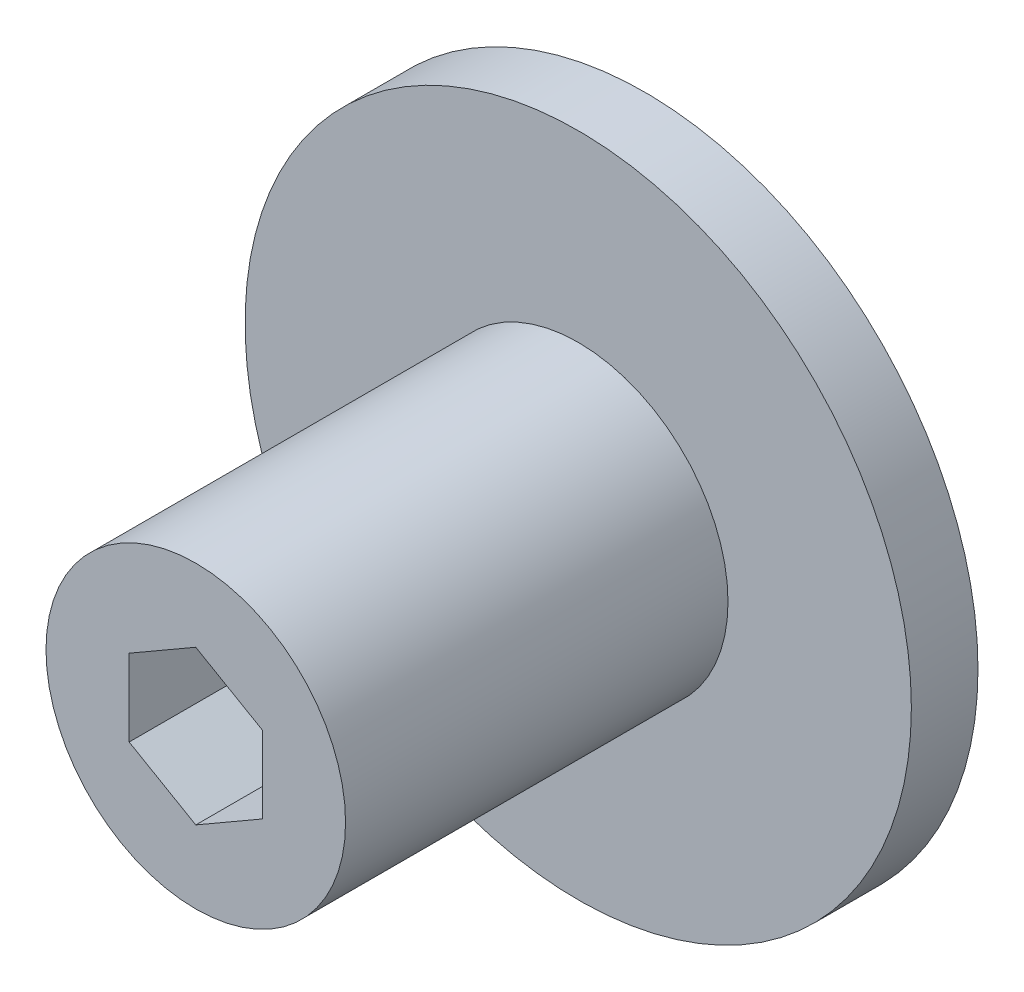
ISO-10303-21;
HEADER;
FILE_DESCRIPTION(('STEP AP214'),'2;1');
FILE_NAME('part.step','',(''),(''),'','','');
FILE_SCHEMA(('AUTOMOTIVE_DESIGN { 1 0 10303 214 1 1 1 1 }'));
ENDSEC;
DATA;
#1=APPLICATION_CONTEXT('core data for automotive mechanical design processes');
#2=APPLICATION_PROTOCOL_DEFINITION('international standard','automotive_design',2000,#1);
#3=PRODUCT_CONTEXT('',#1,'mechanical');
#4=PRODUCT('Part','Part','',(#3));
#5=PRODUCT_RELATED_PRODUCT_CATEGORY('part','',(#4));
#6=PRODUCT_DEFINITION_FORMATION('','',#4);
#7=PRODUCT_DEFINITION_CONTEXT('part definition',#1,'design');
#8=PRODUCT_DEFINITION('design','',#6,#7);
#9=PRODUCT_DEFINITION_SHAPE('','',#8);
#10=(LENGTH_UNIT() NAMED_UNIT(*) SI_UNIT(.MILLI.,.METRE.));
#11=(NAMED_UNIT(*) PLANE_ANGLE_UNIT() SI_UNIT($,.RADIAN.));
#12=(NAMED_UNIT(*) SI_UNIT($,.STERADIAN.) SOLID_ANGLE_UNIT());
#13=UNCERTAINTY_MEASURE_WITH_UNIT(LENGTH_MEASURE(1.E-05),#10,'distance_accuracy_value','');
#14=(GEOMETRIC_REPRESENTATION_CONTEXT(3) GLOBAL_UNCERTAINTY_ASSIGNED_CONTEXT((#13)) GLOBAL_UNIT_ASSIGNED_CONTEXT((#10,
#11,#12)) REPRESENTATION_CONTEXT('',''));
#15=CARTESIAN_POINT('',(0.,0.,0.));
#16=DIRECTION('',(0.,0.,1.));
#17=DIRECTION('',(1.,0.,0.));
#18=AXIS2_PLACEMENT_3D('',#15,#16,#17);
#19=CARTESIAN_POINT('',(0.,0.,3.175));
#20=DIRECTION('',(0.,0.,-1.));
#21=DIRECTION('',(-1.,0.,0.));
#22=AXIS2_PLACEMENT_3D('',#19,#20,#21);
#23=CYLINDRICAL_SURFACE('',#22,31.75);
#24=CARTESIAN_POINT('',(0.,0.,3.175));
#25=DIRECTION('',(0.,0.,1.));
#26=DIRECTION('',(1.,0.,0.));
#27=AXIS2_PLACEMENT_3D('',#24,#25,#26);
#28=CIRCLE('',#27,31.75);
#29=CARTESIAN_POINT('',(31.75,0.,3.175));
#30=VERTEX_POINT('',#29);
#31=EDGE_CURVE('E11',#30,#30,#28,.T.);
#32=ORIENTED_EDGE('',*,*,#31,.F.);
#33=EDGE_LOOP('',(#32));
#34=FACE_BOUND('',#33,.T.);
#35=CARTESIAN_POINT('',(0.,0.,-3.175));
#36=DIRECTION('',(0.,0.,1.));
#37=DIRECTION('',(1.,0.,0.));
#38=AXIS2_PLACEMENT_3D('',#35,#36,#37);
#39=CIRCLE('',#38,31.75);
#40=CARTESIAN_POINT('',(31.75,0.,-3.175));
#41=VERTEX_POINT('',#40);
#42=EDGE_CURVE('E35',#41,#41,#39,.T.);
#43=ORIENTED_EDGE('',*,*,#42,.T.);
#44=EDGE_LOOP('',(#43));
#45=FACE_BOUND('',#44,.T.);
#46=ADVANCED_FACE('F32',(#34,#45),#23,.T.);
#47=CARTESIAN_POINT('',(0.,0.,3.175));
#48=DIRECTION('',(0.,0.,1.));
#49=DIRECTION('',(1.,0.,0.));
#50=AXIS2_PLACEMENT_3D('',#47,#48,#49);
#51=PLANE('',#50);
#52=CARTESIAN_POINT('',(0.,0.,3.175));
#53=DIRECTION('',(0.,0.,1.));
#54=DIRECTION('',(1.,0.,0.));
#55=AXIS2_PLACEMENT_3D('',#52,#53,#54);
#56=CIRCLE('',#55,14.2748);
#57=CARTESIAN_POINT('',(14.2748,0.,3.175));
#58=VERTEX_POINT('',#57);
#59=EDGE_CURVE('E427',#58,#58,#56,.T.);
#60=ORIENTED_EDGE('',*,*,#59,.F.);
#61=EDGE_LOOP('',(#60));
#62=FACE_BOUND('',#61,.T.);
#63=ORIENTED_EDGE('',*,*,#31,.T.);
#64=EDGE_LOOP('',(#63));
#65=FACE_BOUND('',#64,.T.);
#66=ADVANCED_FACE('F481',(#62,#65),#51,.T.);
#67=CARTESIAN_POINT('',(0.,0.,-3.175));
#68=DIRECTION('',(0.,0.,1.));
#69=DIRECTION('',(1.,0.,0.));
#70=AXIS2_PLACEMENT_3D('',#67,#68,#69);
#71=PLANE('',#70);
#72=DIRECTION('',(0.,-1.,0.));
#73=VECTOR('',#72,1.);
#74=CARTESIAN_POINT('',(10.0667013276303,1.984375,-3.175));
#75=LINE('',#74,#73);
#76=CARTESIAN_POINT('',(10.0667013276303,1.984375,-3.175));
#77=VERTEX_POINT('',#76);
#78=CARTESIAN_POINT('',(10.0667013276303,-1.984375,-3.175));
#79=VERTEX_POINT('',#78);
#80=EDGE_CURVE('E357',#77,#79,#75,.T.);
#81=ORIENTED_EDGE('',*,*,#80,.F.);
#82=DIRECTION('',(1.,0.,0.));
#83=VECTOR('',#82,1.);
#84=CARTESIAN_POINT('',(10.0667013276303,1.984375,-3.175));
#85=LINE('',#84,#83);
#86=CARTESIAN_POINT('',(7.68545132763034,1.984375,-3.175));
#87=VERTEX_POINT('',#86);
#88=EDGE_CURVE('E54',#87,#77,#85,.T.);
#89=ORIENTED_EDGE('',*,*,#88,.F.);
#90=CARTESIAN_POINT('',(0.,0.,-3.175));
#91=DIRECTION('',(0.,0.,-1.));
#92=DIRECTION('',(-1.,0.,0.));
#93=AXIS2_PLACEMENT_3D('',#90,#91,#92);
#94=CIRCLE('',#93,7.9375);
#95=CARTESIAN_POINT('',(5.56124482444992,5.66360858927672,-3.175));
#96=VERTEX_POINT('',#95);
#97=EDGE_CURVE('E286',#96,#87,#94,.T.);
#98=ORIENTED_EDGE('',*,*,#97,.F.);
#99=DIRECTION('',(-0.5,-0.866025403784438,0.));
#100=VECTOR('',#99,1.);
#101=CARTESIAN_POINT('',(6.75186982444992,7.72583158203841,-3.175));
#102=LINE('',#101,#100);
#103=CARTESIAN_POINT('',(6.75186982444992,7.72583158203841,-3.175));
#104=VERTEX_POINT('',#103);
#105=EDGE_CURVE('E420',#104,#96,#102,.T.);
#106=ORIENTED_EDGE('',*,*,#105,.F.);
#107=DIRECTION('',(0.866025403784439,-0.5,0.));
#108=VECTOR('',#107,1.);
#109=CARTESIAN_POINT('',(3.31483150318043,9.71020658203841,-3.175));
#110=LINE('',#109,#108);
#111=CARTESIAN_POINT('',(3.31483150318043,9.71020658203841,-3.175));
#112=VERTEX_POINT('',#111);
#113=EDGE_CURVE('E417',#112,#104,#110,.T.);
#114=ORIENTED_EDGE('',*,*,#113,.F.);
#115=DIRECTION('',(0.5,0.866025403784439,0.));
#116=VECTOR('',#115,1.);
#117=CARTESIAN_POINT('',(3.31483150318043,9.71020658203841,-3.175));
#118=LINE('',#117,#116);
#119=CARTESIAN_POINT('',(2.12420650318043,7.64798358927672,-3.175));
#120=VERTEX_POINT('',#119);
#121=EDGE_CURVE('E414',#120,#112,#118,.T.);
#122=ORIENTED_EDGE('',*,*,#121,.F.);
#123=CARTESIAN_POINT('',(0.,0.,-3.175));
#124=DIRECTION('',(0.,0.,-1.));
#125=DIRECTION('',(-1.,0.,0.));
#126=AXIS2_PLACEMENT_3D('',#123,#124,#125);
#127=CIRCLE('',#126,7.9375);
#128=CARTESIAN_POINT('',(-2.12420650318042,7.64798358927672,-3.175));
#129=VERTEX_POINT('',#128);
#130=EDGE_CURVE('E411',#129,#120,#127,.T.);
#131=ORIENTED_EDGE('',*,*,#130,.F.);
#132=DIRECTION('',(0.5,-0.866025403784439,0.));
#133=VECTOR('',#132,1.);
#134=CARTESIAN_POINT('',(-3.31483150318043,9.71020658203842,-3.175));
#135=LINE('',#134,#133);
#136=CARTESIAN_POINT('',(-3.31483150318043,9.71020658203842,-3.175));
#137=VERTEX_POINT('',#136);
#138=EDGE_CURVE('E408',#137,#129,#135,.T.);
#139=ORIENTED_EDGE('',*,*,#138,.F.);
#140=DIRECTION('',(0.866025403784439,0.5,0.));
#141=VECTOR('',#140,1.);
#142=CARTESIAN_POINT('',(-6.75186982444992,7.72583158203842,-3.175));
#143=LINE('',#142,#141);
#144=CARTESIAN_POINT('',(-6.75186982444992,7.72583158203842,-3.175));
#145=VERTEX_POINT('',#144);
#146=EDGE_CURVE('E405',#145,#137,#143,.T.);
#147=ORIENTED_EDGE('',*,*,#146,.F.);
#148=DIRECTION('',(-0.5,0.866025403784439,0.));
#149=VECTOR('',#148,1.);
#150=CARTESIAN_POINT('',(-6.75186982444992,7.72583158203842,-3.175));
#151=LINE('',#150,#149);
#152=CARTESIAN_POINT('',(-5.56124482444991,5.66360858927672,-3.175));
#153=VERTEX_POINT('',#152);
#154=EDGE_CURVE('E402',#153,#145,#151,.T.);
#155=ORIENTED_EDGE('',*,*,#154,.F.);
#156=CARTESIAN_POINT('',(0.,0.,-3.175));
#157=DIRECTION('',(0.,0.,-1.));
#158=DIRECTION('',(-1.,0.,0.));
#159=AXIS2_PLACEMENT_3D('',#156,#157,#158);
#160=CIRCLE('',#159,7.9375);
#161=CARTESIAN_POINT('',(-7.68545132763034,1.984375,-3.175));
#162=VERTEX_POINT('',#161);
#163=EDGE_CURVE('E399',#162,#153,#160,.T.);
#164=ORIENTED_EDGE('',*,*,#163,.F.);
#165=DIRECTION('',(1.,0.,0.));
#166=VECTOR('',#165,1.);
#167=CARTESIAN_POINT('',(-10.0667013276303,1.984375,-3.175));
#168=LINE('',#167,#166);
#169=CARTESIAN_POINT('',(-10.0667013276303,1.984375,-3.175));
#170=VERTEX_POINT('',#169);
#171=EDGE_CURVE('E396',#170,#162,#168,.T.);
#172=ORIENTED_EDGE('',*,*,#171,.F.);
#173=DIRECTION('',(0.,1.,0.));
#174=VECTOR('',#173,1.);
#175=CARTESIAN_POINT('',(-10.0667013276303,-1.984375,-3.175));
#176=LINE('',#175,#174);
#177=CARTESIAN_POINT('',(-10.0667013276303,-1.984375,-3.175));
#178=VERTEX_POINT('',#177);
#179=EDGE_CURVE('E393',#178,#170,#176,.T.);
#180=ORIENTED_EDGE('',*,*,#179,.F.);
#181=DIRECTION('',(-1.,0.,0.));
#182=VECTOR('',#181,1.);
#183=CARTESIAN_POINT('',(-10.0667013276303,-1.984375,-3.175));
#184=LINE('',#183,#182);
#185=CARTESIAN_POINT('',(-7.68545132763034,-1.984375,-3.175));
#186=VERTEX_POINT('',#185);
#187=EDGE_CURVE('E390',#186,#178,#184,.T.);
#188=ORIENTED_EDGE('',*,*,#187,.F.);
#189=CARTESIAN_POINT('',(0.,0.,-3.175));
#190=DIRECTION('',(0.,0.,-1.));
#191=DIRECTION('',(-1.,0.,0.));
#192=AXIS2_PLACEMENT_3D('',#189,#190,#191);
#193=CIRCLE('',#192,7.9375);
#194=CARTESIAN_POINT('',(-5.56124482444992,-5.66360858927671,-3.175));
#195=VERTEX_POINT('',#194);
#196=EDGE_CURVE('E387',#195,#186,#193,.T.);
#197=ORIENTED_EDGE('',*,*,#196,.F.);
#198=DIRECTION('',(0.5,0.866025403784439,0.));
#199=VECTOR('',#198,1.);
#200=CARTESIAN_POINT('',(-6.75186982444992,-7.72583158203841,-3.175));
#201=LINE('',#200,#199);
#202=CARTESIAN_POINT('',(-6.75186982444992,-7.72583158203841,-3.175));
#203=VERTEX_POINT('',#202);
#204=EDGE_CURVE('E384',#203,#195,#201,.T.);
#205=ORIENTED_EDGE('',*,*,#204,.F.);
#206=DIRECTION('',(-0.866025403784439,0.5,0.));
#207=VECTOR('',#206,1.);
#208=CARTESIAN_POINT('',(-3.31483150318043,-9.71020658203841,-3.175));
#209=LINE('',#208,#207);
#210=CARTESIAN_POINT('',(-3.31483150318043,-9.71020658203841,-3.175));
#211=VERTEX_POINT('',#210);
#212=EDGE_CURVE('E381',#211,#203,#209,.T.);
#213=ORIENTED_EDGE('',*,*,#212,.F.);
#214=DIRECTION('',(-0.5,-0.866025403784438,0.));
#215=VECTOR('',#214,1.);
#216=CARTESIAN_POINT('',(-3.31483150318043,-9.71020658203841,-3.175));
#217=LINE('',#216,#215);
#218=CARTESIAN_POINT('',(-2.12420650318043,-7.64798358927672,-3.175));
#219=VERTEX_POINT('',#218);
#220=EDGE_CURVE('E378',#219,#211,#217,.T.);
#221=ORIENTED_EDGE('',*,*,#220,.F.);
#222=CARTESIAN_POINT('',(0.,0.,-3.175));
#223=DIRECTION('',(0.,0.,-1.));
#224=DIRECTION('',(-1.,0.,0.));
#225=AXIS2_PLACEMENT_3D('',#222,#223,#224);
#226=CIRCLE('',#225,7.9375);
#227=CARTESIAN_POINT('',(2.12420650318042,-7.64798358927672,-3.175));
#228=VERTEX_POINT('',#227);
#229=EDGE_CURVE('E375',#228,#219,#226,.T.);
#230=ORIENTED_EDGE('',*,*,#229,.F.);
#231=DIRECTION('',(-0.5,0.866025403784438,0.));
#232=VECTOR('',#231,1.);
#233=CARTESIAN_POINT('',(3.31483150318042,-9.71020658203842,-3.175));
#234=LINE('',#233,#232);
#235=CARTESIAN_POINT('',(3.31483150318042,-9.71020658203842,-3.175));
#236=VERTEX_POINT('',#235);
#237=EDGE_CURVE('E372',#236,#228,#234,.T.);
#238=ORIENTED_EDGE('',*,*,#237,.F.);
#239=DIRECTION('',(-0.866025403784439,-0.5,0.));
#240=VECTOR('',#239,1.);
#241=CARTESIAN_POINT('',(6.75186982444991,-7.72583158203842,-3.175));
#242=LINE('',#241,#240);
#243=CARTESIAN_POINT('',(6.75186982444991,-7.72583158203842,-3.175));
#244=VERTEX_POINT('',#243);
#245=EDGE_CURVE('E369',#244,#236,#242,.T.);
#246=ORIENTED_EDGE('',*,*,#245,.F.);
#247=DIRECTION('',(0.5,-0.866025403784438,0.));
#248=VECTOR('',#247,1.);
#249=CARTESIAN_POINT('',(6.75186982444991,-7.72583158203842,-3.175));
#250=LINE('',#249,#248);
#251=CARTESIAN_POINT('',(5.56124482444991,-5.66360858927672,-3.175));
#252=VERTEX_POINT('',#251);
#253=EDGE_CURVE('E366',#252,#244,#250,.T.);
#254=ORIENTED_EDGE('',*,*,#253,.F.);
#255=CARTESIAN_POINT('',(0.,0.,-3.175));
#256=DIRECTION('',(0.,0.,-1.));
#257=DIRECTION('',(-1.,0.,0.));
#258=AXIS2_PLACEMENT_3D('',#255,#256,#257);
#259=CIRCLE('',#258,7.9375);
#260=CARTESIAN_POINT('',(7.68545132763034,-1.984375,-3.175));
#261=VERTEX_POINT('',#260);
#262=EDGE_CURVE('E363',#261,#252,#259,.T.);
#263=ORIENTED_EDGE('',*,*,#262,.F.);
#264=DIRECTION('',(-1.,0.,0.));
#265=VECTOR('',#264,1.);
#266=CARTESIAN_POINT('',(10.0667013276303,-1.984375,-3.175));
#267=LINE('',#266,#265);
#268=EDGE_CURVE('E360',#79,#261,#267,.T.);
#269=ORIENTED_EDGE('',*,*,#268,.F.);
#270=EDGE_LOOP('',(#81,#89,#98,#106,#114,#122,#131,#139,#147,#155,#164,#172,#180,#188,#197,#205,
#213,#221,#230,#238,#246,#254,#263,#269));
#271=FACE_BOUND('',#270,.T.);
#272=ORIENTED_EDGE('',*,*,#42,.F.);
#273=EDGE_LOOP('',(#272));
#274=FACE_BOUND('',#273,.T.);
#275=ADVANCED_FACE('F484',(#271,#274),#71,.F.);
#276=CARTESIAN_POINT('',(0.,0.,39.624));
#277=DIRECTION('',(0.,0.,-1.));
#278=DIRECTION('',(-1.,0.,0.));
#279=AXIS2_PLACEMENT_3D('',#276,#277,#278);
#280=CYLINDRICAL_SURFACE('',#279,14.2748);
#281=CARTESIAN_POINT('',(0.,0.,39.624));
#282=DIRECTION('',(0.,0.,1.));
#283=DIRECTION('',(1.,0.,0.));
#284=AXIS2_PLACEMENT_3D('',#281,#282,#283);
#285=CIRCLE('',#284,14.2748);
#286=CARTESIAN_POINT('',(14.2748,0.,39.624));
#287=VERTEX_POINT('',#286);
#288=EDGE_CURVE('E473',#287,#287,#285,.T.);
#289=ORIENTED_EDGE('',*,*,#288,.F.);
#290=EDGE_LOOP('',(#289));
#291=FACE_BOUND('',#290,.T.);
#292=ORIENTED_EDGE('',*,*,#59,.T.);
#293=EDGE_LOOP('',(#292));
#294=FACE_BOUND('',#293,.T.);
#295=ADVANCED_FACE('F479',(#291,#294),#280,.T.);
#296=CARTESIAN_POINT('',(0.,0.,39.624));
#297=DIRECTION('',(0.,0.,1.));
#298=DIRECTION('',(1.,0.,0.));
#299=AXIS2_PLACEMENT_3D('',#296,#297,#298);
#300=PLANE('',#299);
#301=DIRECTION('',(-0.866025403784439,0.5,0.));
#302=VECTOR('',#301,1.);
#303=CARTESIAN_POINT('',(6.35,3.66617420935412,39.624));
#304=LINE('',#303,#302);
#305=CARTESIAN_POINT('',(6.35,3.66617420935412,39.624));
#306=VERTEX_POINT('',#305);
#307=CARTESIAN_POINT('',(0.,7.33234841870825,39.624));
#308=VERTEX_POINT('',#307);
#309=EDGE_CURVE('E46',#306,#308,#304,.T.);
#310=ORIENTED_EDGE('',*,*,#309,.F.);
#311=DIRECTION('',(0.,1.,0.));
#312=VECTOR('',#311,1.);
#313=CARTESIAN_POINT('',(6.35,-3.66617420935412,39.624));
#314=LINE('',#313,#312);
#315=CARTESIAN_POINT('',(6.35,-3.66617420935412,39.624));
#316=VERTEX_POINT('',#315);
#317=EDGE_CURVE('E249',#316,#306,#314,.T.);
#318=ORIENTED_EDGE('',*,*,#317,.F.);
#319=DIRECTION('',(0.866025403784439,0.5,0.));
#320=VECTOR('',#319,1.);
#321=CARTESIAN_POINT('',(0.,-7.33234841870825,39.624));
#322=LINE('',#321,#320);
#323=CARTESIAN_POINT('',(0.,-7.33234841870825,39.624));
#324=VERTEX_POINT('',#323);
#325=EDGE_CURVE('E252',#324,#316,#322,.T.);
#326=ORIENTED_EDGE('',*,*,#325,.F.);
#327=DIRECTION('',(0.866025403784439,-0.5,0.));
#328=VECTOR('',#327,1.);
#329=CARTESIAN_POINT('',(-6.35,-3.66617420935412,39.624));
#330=LINE('',#329,#328);
#331=CARTESIAN_POINT('',(-6.35,-3.66617420935412,39.624));
#332=VERTEX_POINT('',#331);
#333=EDGE_CURVE('E268',#332,#324,#330,.T.);
#334=ORIENTED_EDGE('',*,*,#333,.F.);
#335=DIRECTION('',(0.,-1.,0.));
#336=VECTOR('',#335,1.);
#337=CARTESIAN_POINT('',(-6.35,3.66617420935412,39.624));
#338=LINE('',#337,#336);
#339=CARTESIAN_POINT('',(-6.35,3.66617420935412,39.624));
#340=VERTEX_POINT('',#339);
#341=EDGE_CURVE('E265',#340,#332,#338,.T.);
#342=ORIENTED_EDGE('',*,*,#341,.F.);
#343=DIRECTION('',(-0.866025403784439,-0.5,0.));
#344=VECTOR('',#343,1.);
#345=CARTESIAN_POINT('',(0.,7.33234841870825,39.624));
#346=LINE('',#345,#344);
#347=EDGE_CURVE('E263',#308,#340,#346,.T.);
#348=ORIENTED_EDGE('',*,*,#347,.F.);
#349=EDGE_LOOP('',(#310,#318,#326,#334,#342,#348));
#350=FACE_BOUND('',#349,.T.);
#351=ORIENTED_EDGE('',*,*,#288,.T.);
#352=EDGE_LOOP('',(#351));
#353=FACE_BOUND('',#352,.T.);
#354=ADVANCED_FACE('F498',(#350,#353),#300,.T.);
#355=CARTESIAN_POINT('',(10.0667013276303,1.984375,22.225));
#356=DIRECTION('',(0.,1.,0.));
#357=DIRECTION('',(-1.,0.,0.));
#358=AXIS2_PLACEMENT_3D('',#355,#356,#357);
#359=PLANE('',#358);
#360=ORIENTED_EDGE('',*,*,#88,.T.);
#361=DIRECTION('',(0.,0.,-1.));
#362=VECTOR('',#361,1.);
#363=CARTESIAN_POINT('',(10.0667013276303,1.984375,22.225));
#364=LINE('',#363,#362);
#365=CARTESIAN_POINT('',(10.0667013276303,1.984375,22.225));
#366=VERTEX_POINT('',#365);
#367=EDGE_CURVE('E355',#366,#77,#364,.T.);
#368=ORIENTED_EDGE('',*,*,#367,.F.);
#369=DIRECTION('',(1.,0.,0.));
#370=VECTOR('',#369,1.);
#371=CARTESIAN_POINT('',(10.0667013276303,1.984375,22.225));
#372=LINE('',#371,#370);
#373=CARTESIAN_POINT('',(7.68545132763034,1.984375,22.225));
#374=VERTEX_POINT('',#373);
#375=EDGE_CURVE('E282',#374,#366,#372,.T.);
#376=ORIENTED_EDGE('',*,*,#375,.F.);
#377=DIRECTION('',(0.,0.,-1.));
#378=VECTOR('',#377,1.);
#379=CARTESIAN_POINT('',(7.68545132763034,1.984375,22.225));
#380=LINE('',#379,#378);
#381=EDGE_CURVE('E425',#374,#87,#380,.T.);
#382=ORIENTED_EDGE('',*,*,#381,.T.);
#383=EDGE_LOOP('',(#360,#368,#376,#382));
#384=FACE_BOUND('',#383,.T.);
#385=ADVANCED_FACE('F505',(#384),#359,.F.);
#386=CARTESIAN_POINT('',(0.,0.,22.225));
#387=DIRECTION('',(0.,0.,-1.));
#388=DIRECTION('',(-1.,0.,0.));
#389=AXIS2_PLACEMENT_3D('',#386,#387,#388);
#390=CYLINDRICAL_SURFACE('',#389,7.9375);
#391=ORIENTED_EDGE('',*,*,#97,.T.);
#392=ORIENTED_EDGE('',*,*,#381,.F.);
#393=CARTESIAN_POINT('',(0.,0.,22.225));
#394=DIRECTION('',(0.,0.,-1.));
#395=DIRECTION('',(-1.,0.,0.));
#396=AXIS2_PLACEMENT_3D('',#393,#394,#395);
#397=CIRCLE('',#396,7.9375);
#398=CARTESIAN_POINT('',(5.56124482444992,5.66360858927672,22.225));
#399=VERTEX_POINT('',#398);
#400=EDGE_CURVE('E352',#399,#374,#397,.T.);
#401=ORIENTED_EDGE('',*,*,#400,.F.);
#402=DIRECTION('',(0.,0.,-1.));
#403=VECTOR('',#402,1.);
#404=CARTESIAN_POINT('',(5.56124482444992,5.66360858927672,22.225));
#405=LINE('',#404,#403);
#406=EDGE_CURVE('E428',#399,#96,#405,.T.);
#407=ORIENTED_EDGE('',*,*,#406,.T.);
#408=EDGE_LOOP('',(#391,#392,#401,#407));
#409=FACE_BOUND('',#408,.T.);
#410=ADVANCED_FACE('F509',(#409),#390,.F.);
#411=CARTESIAN_POINT('',(6.75186982444992,7.72583158203841,22.225));
#412=DIRECTION('',(0.866025403784439,-0.5,0.));
#413=DIRECTION('',(0.5,0.866025403784439,0.));
#414=AXIS2_PLACEMENT_3D('',#411,#412,#413);
#415=PLANE('',#414);
#416=ORIENTED_EDGE('',*,*,#105,.T.);
#417=ORIENTED_EDGE('',*,*,#406,.F.);
#418=DIRECTION('',(-0.5,-0.866025403784438,0.));
#419=VECTOR('',#418,1.);
#420=CARTESIAN_POINT('',(6.75186982444992,7.72583158203841,22.225));
#421=LINE('',#420,#419);
#422=CARTESIAN_POINT('',(6.75186982444992,7.72583158203841,22.225));
#423=VERTEX_POINT('',#422);
#424=EDGE_CURVE('E349',#423,#399,#421,.T.);
#425=ORIENTED_EDGE('',*,*,#424,.F.);
#426=DIRECTION('',(0.,0.,-1.));
#427=VECTOR('',#426,1.);
#428=CARTESIAN_POINT('',(6.75186982444992,7.72583158203841,22.225));
#429=LINE('',#428,#427);
#430=EDGE_CURVE('E430',#423,#104,#429,.T.);
#431=ORIENTED_EDGE('',*,*,#430,.T.);
#432=EDGE_LOOP('',(#416,#417,#425,#431));
#433=FACE_BOUND('',#432,.T.);
#434=ADVANCED_FACE('F594',(#433),#415,.F.);
#435=CARTESIAN_POINT('',(3.31483150318043,9.71020658203841,22.225));
#436=DIRECTION('',(0.5,0.866025403784439,0.));
#437=DIRECTION('',(-0.866025403784439,0.5,0.));
#438=AXIS2_PLACEMENT_3D('',#435,#436,#437);
#439=PLANE('',#438);
#440=ORIENTED_EDGE('',*,*,#113,.T.);
#441=ORIENTED_EDGE('',*,*,#430,.F.);
#442=DIRECTION('',(0.866025403784439,-0.5,0.));
#443=VECTOR('',#442,1.);
#444=CARTESIAN_POINT('',(3.31483150318043,9.71020658203841,22.225));
#445=LINE('',#444,#443);
#446=CARTESIAN_POINT('',(3.31483150318043,9.71020658203841,22.225));
#447=VERTEX_POINT('',#446);
#448=EDGE_CURVE('E346',#447,#423,#445,.T.);
#449=ORIENTED_EDGE('',*,*,#448,.F.);
#450=DIRECTION('',(0.,0.,-1.));
#451=VECTOR('',#450,1.);
#452=CARTESIAN_POINT('',(3.31483150318043,9.71020658203841,22.225));
#453=LINE('',#452,#451);
#454=EDGE_CURVE('E432',#447,#112,#453,.T.);
#455=ORIENTED_EDGE('',*,*,#454,.T.);
#456=EDGE_LOOP('',(#440,#441,#449,#455));
#457=FACE_BOUND('',#456,.T.);
#458=ADVANCED_FACE('F590',(#457),#439,.F.);
#459=CARTESIAN_POINT('',(3.31483150318043,9.71020658203841,22.225));
#460=DIRECTION('',(-0.866025403784439,0.5,0.));
#461=DIRECTION('',(-0.5,-0.866025403784439,0.));
#462=AXIS2_PLACEMENT_3D('',#459,#460,#461);
#463=PLANE('',#462);
#464=ORIENTED_EDGE('',*,*,#121,.T.);
#465=ORIENTED_EDGE('',*,*,#454,.F.);
#466=DIRECTION('',(0.5,0.866025403784439,0.));
#467=VECTOR('',#466,1.);
#468=CARTESIAN_POINT('',(3.31483150318043,9.71020658203841,22.225));
#469=LINE('',#468,#467);
#470=CARTESIAN_POINT('',(2.12420650318043,7.64798358927672,22.225));
#471=VERTEX_POINT('',#470);
#472=EDGE_CURVE('E343',#471,#447,#469,.T.);
#473=ORIENTED_EDGE('',*,*,#472,.F.);
#474=DIRECTION('',(0.,0.,-1.));
#475=VECTOR('',#474,1.);
#476=CARTESIAN_POINT('',(2.12420650318043,7.64798358927672,22.225));
#477=LINE('',#476,#475);
#478=EDGE_CURVE('E434',#471,#120,#477,.T.);
#479=ORIENTED_EDGE('',*,*,#478,.T.);
#480=EDGE_LOOP('',(#464,#465,#473,#479));
#481=FACE_BOUND('',#480,.T.);
#482=ADVANCED_FACE('F586',(#481),#463,.F.);
#483=CARTESIAN_POINT('',(0.,0.,22.225));
#484=DIRECTION('',(0.,0.,-1.));
#485=DIRECTION('',(-1.,0.,0.));
#486=AXIS2_PLACEMENT_3D('',#483,#484,#485);
#487=CYLINDRICAL_SURFACE('',#486,7.9375);
#488=ORIENTED_EDGE('',*,*,#130,.T.);
#489=ORIENTED_EDGE('',*,*,#478,.F.);
#490=CARTESIAN_POINT('',(0.,0.,22.225));
#491=DIRECTION('',(0.,0.,-1.));
#492=DIRECTION('',(-1.,0.,0.));
#493=AXIS2_PLACEMENT_3D('',#490,#491,#492);
#494=CIRCLE('',#493,7.9375);
#495=CARTESIAN_POINT('',(-2.12420650318042,7.64798358927672,22.225));
#496=VERTEX_POINT('',#495);
#497=EDGE_CURVE('E340',#496,#471,#494,.T.);
#498=ORIENTED_EDGE('',*,*,#497,.F.);
#499=DIRECTION('',(0.,0.,-1.));
#500=VECTOR('',#499,1.);
#501=CARTESIAN_POINT('',(-2.12420650318042,7.64798358927672,22.225));
#502=LINE('',#501,#500);
#503=EDGE_CURVE('E436',#496,#129,#502,.T.);
#504=ORIENTED_EDGE('',*,*,#503,.T.);
#505=EDGE_LOOP('',(#488,#489,#498,#504));
#506=FACE_BOUND('',#505,.T.);
#507=ADVANCED_FACE('F582',(#506),#487,.F.);
#508=CARTESIAN_POINT('',(-3.31483150318043,9.71020658203842,22.225));
#509=DIRECTION('',(0.866025403784439,0.5,0.));
#510=DIRECTION('',(-0.5,0.866025403784439,0.));
#511=AXIS2_PLACEMENT_3D('',#508,#509,#510);
#512=PLANE('',#511);
#513=ORIENTED_EDGE('',*,*,#138,.T.);
#514=ORIENTED_EDGE('',*,*,#503,.F.);
#515=DIRECTION('',(0.5,-0.866025403784439,0.));
#516=VECTOR('',#515,1.);
#517=CARTESIAN_POINT('',(-3.31483150318043,9.71020658203842,22.225));
#518=LINE('',#517,#516);
#519=CARTESIAN_POINT('',(-3.31483150318043,9.71020658203842,22.225));
#520=VERTEX_POINT('',#519);
#521=EDGE_CURVE('E337',#520,#496,#518,.T.);
#522=ORIENTED_EDGE('',*,*,#521,.F.);
#523=DIRECTION('',(0.,0.,-1.));
#524=VECTOR('',#523,1.);
#525=CARTESIAN_POINT('',(-3.31483150318043,9.71020658203842,22.225));
#526=LINE('',#525,#524);
#527=EDGE_CURVE('E438',#520,#137,#526,.T.);
#528=ORIENTED_EDGE('',*,*,#527,.T.);
#529=EDGE_LOOP('',(#513,#514,#522,#528));
#530=FACE_BOUND('',#529,.T.);
#531=ADVANCED_FACE('F578',(#530),#512,.F.);
#532=CARTESIAN_POINT('',(-6.75186982444992,7.72583158203842,22.225));
#533=DIRECTION('',(-0.5,0.866025403784438,0.));
#534=DIRECTION('',(-0.866025403784439,-0.5,0.));
#535=AXIS2_PLACEMENT_3D('',#532,#533,#534);
#536=PLANE('',#535);
#537=ORIENTED_EDGE('',*,*,#146,.T.);
#538=ORIENTED_EDGE('',*,*,#527,.F.);
#539=DIRECTION('',(0.866025403784439,0.5,0.));
#540=VECTOR('',#539,1.);
#541=CARTESIAN_POINT('',(-6.75186982444992,7.72583158203842,22.225));
#542=LINE('',#541,#540);
#543=CARTESIAN_POINT('',(-6.75186982444992,7.72583158203842,22.225));
#544=VERTEX_POINT('',#543);
#545=EDGE_CURVE('E334',#544,#520,#542,.T.);
#546=ORIENTED_EDGE('',*,*,#545,.F.);
#547=DIRECTION('',(0.,0.,-1.));
#548=VECTOR('',#547,1.);
#549=CARTESIAN_POINT('',(-6.75186982444992,7.72583158203842,22.225));
#550=LINE('',#549,#548);
#551=EDGE_CURVE('E440',#544,#145,#550,.T.);
#552=ORIENTED_EDGE('',*,*,#551,.T.);
#553=EDGE_LOOP('',(#537,#538,#546,#552));
#554=FACE_BOUND('',#553,.T.);
#555=ADVANCED_FACE('F574',(#554),#536,.F.);
#556=CARTESIAN_POINT('',(-6.75186982444992,7.72583158203842,22.225));
#557=DIRECTION('',(-0.866025403784439,-0.5,0.));
#558=DIRECTION('',(0.5,-0.866025403784439,0.));
#559=AXIS2_PLACEMENT_3D('',#556,#557,#558);
#560=PLANE('',#559);
#561=ORIENTED_EDGE('',*,*,#154,.T.);
#562=ORIENTED_EDGE('',*,*,#551,.F.);
#563=DIRECTION('',(-0.5,0.866025403784439,0.));
#564=VECTOR('',#563,1.);
#565=CARTESIAN_POINT('',(-6.75186982444992,7.72583158203842,22.225));
#566=LINE('',#565,#564);
#567=CARTESIAN_POINT('',(-5.56124482444991,5.66360858927672,22.225));
#568=VERTEX_POINT('',#567);
#569=EDGE_CURVE('E331',#568,#544,#566,.T.);
#570=ORIENTED_EDGE('',*,*,#569,.F.);
#571=DIRECTION('',(0.,0.,-1.));
#572=VECTOR('',#571,1.);
#573=CARTESIAN_POINT('',(-5.56124482444991,5.66360858927672,22.225));
#574=LINE('',#573,#572);
#575=EDGE_CURVE('E442',#568,#153,#574,.T.);
#576=ORIENTED_EDGE('',*,*,#575,.T.);
#577=EDGE_LOOP('',(#561,#562,#570,#576));
#578=FACE_BOUND('',#577,.T.);
#579=ADVANCED_FACE('F570',(#578),#560,.F.);
#580=CARTESIAN_POINT('',(0.,0.,22.225));
#581=DIRECTION('',(0.,0.,-1.));
#582=DIRECTION('',(-1.,0.,0.));
#583=AXIS2_PLACEMENT_3D('',#580,#581,#582);
#584=CYLINDRICAL_SURFACE('',#583,7.9375);
#585=ORIENTED_EDGE('',*,*,#163,.T.);
#586=ORIENTED_EDGE('',*,*,#575,.F.);
#587=CARTESIAN_POINT('',(0.,0.,22.225));
#588=DIRECTION('',(0.,0.,-1.));
#589=DIRECTION('',(-1.,0.,0.));
#590=AXIS2_PLACEMENT_3D('',#587,#588,#589);
#591=CIRCLE('',#590,7.9375);
#592=CARTESIAN_POINT('',(-7.68545132763034,1.984375,22.225));
#593=VERTEX_POINT('',#592);
#594=EDGE_CURVE('E328',#593,#568,#591,.T.);
#595=ORIENTED_EDGE('',*,*,#594,.F.);
#596=DIRECTION('',(0.,0.,-1.));
#597=VECTOR('',#596,1.);
#598=CARTESIAN_POINT('',(-7.68545132763034,1.984375,22.225));
#599=LINE('',#598,#597);
#600=EDGE_CURVE('E444',#593,#162,#599,.T.);
#601=ORIENTED_EDGE('',*,*,#600,.T.);
#602=EDGE_LOOP('',(#585,#586,#595,#601));
#603=FACE_BOUND('',#602,.T.);
#604=ADVANCED_FACE('F566',(#603),#584,.F.);
#605=CARTESIAN_POINT('',(-10.0667013276303,1.984375,22.225));
#606=DIRECTION('',(0.,1.,0.));
#607=DIRECTION('',(0.,0.,1.));
#608=AXIS2_PLACEMENT_3D('',#605,#606,#607);
#609=PLANE('',#608);
#610=ORIENTED_EDGE('',*,*,#171,.T.);
#611=ORIENTED_EDGE('',*,*,#600,.F.);
#612=DIRECTION('',(1.,0.,0.));
#613=VECTOR('',#612,1.);
#614=CARTESIAN_POINT('',(-10.0667013276303,1.984375,22.225));
#615=LINE('',#614,#613);
#616=CARTESIAN_POINT('',(-10.0667013276303,1.984375,22.225));
#617=VERTEX_POINT('',#616);
#618=EDGE_CURVE('E325',#617,#593,#615,.T.);
#619=ORIENTED_EDGE('',*,*,#618,.F.);
#620=DIRECTION('',(0.,0.,-1.));
#621=VECTOR('',#620,1.);
#622=CARTESIAN_POINT('',(-10.0667013276303,1.984375,22.225));
#623=LINE('',#622,#621);
#624=EDGE_CURVE('E446',#617,#170,#623,.T.);
#625=ORIENTED_EDGE('',*,*,#624,.T.);
#626=EDGE_LOOP('',(#610,#611,#619,#625));
#627=FACE_BOUND('',#626,.T.);
#628=ADVANCED_FACE('F562',(#627),#609,.F.);
#629=CARTESIAN_POINT('',(-10.0667013276303,-1.984375,22.225));
#630=DIRECTION('',(-1.,0.,0.));
#631=DIRECTION('',(0.,0.,1.));
#632=AXIS2_PLACEMENT_3D('',#629,#630,#631);
#633=PLANE('',#632);
#634=ORIENTED_EDGE('',*,*,#179,.T.);
#635=ORIENTED_EDGE('',*,*,#624,.F.);
#636=DIRECTION('',(0.,1.,0.));
#637=VECTOR('',#636,1.);
#638=CARTESIAN_POINT('',(-10.0667013276303,-1.984375,22.225));
#639=LINE('',#638,#637);
#640=CARTESIAN_POINT('',(-10.0667013276303,-1.984375,22.225));
#641=VERTEX_POINT('',#640);
#642=EDGE_CURVE('E322',#641,#617,#639,.T.);
#643=ORIENTED_EDGE('',*,*,#642,.F.);
#644=DIRECTION('',(0.,0.,-1.));
#645=VECTOR('',#644,1.);
#646=CARTESIAN_POINT('',(-10.0667013276303,-1.984375,22.225));
#647=LINE('',#646,#645);
#648=EDGE_CURVE('E448',#641,#178,#647,.T.);
#649=ORIENTED_EDGE('',*,*,#648,.T.);
#650=EDGE_LOOP('',(#634,#635,#643,#649));
#651=FACE_BOUND('',#650,.T.);
#652=ADVANCED_FACE('F558',(#651),#633,.F.);
#653=CARTESIAN_POINT('',(-10.0667013276303,-1.984375,22.225));
#654=DIRECTION('',(0.,-1.,0.));
#655=DIRECTION('',(0.,0.,-1.));
#656=AXIS2_PLACEMENT_3D('',#653,#654,#655);
#657=PLANE('',#656);
#658=ORIENTED_EDGE('',*,*,#187,.T.);
#659=ORIENTED_EDGE('',*,*,#648,.F.);
#660=DIRECTION('',(-1.,0.,0.));
#661=VECTOR('',#660,1.);
#662=CARTESIAN_POINT('',(-10.0667013276303,-1.984375,22.225));
#663=LINE('',#662,#661);
#664=CARTESIAN_POINT('',(-7.68545132763034,-1.984375,22.225));
#665=VERTEX_POINT('',#664);
#666=EDGE_CURVE('E319',#665,#641,#663,.T.);
#667=ORIENTED_EDGE('',*,*,#666,.F.);
#668=DIRECTION('',(0.,0.,-1.));
#669=VECTOR('',#668,1.);
#670=CARTESIAN_POINT('',(-7.68545132763034,-1.984375,22.225));
#671=LINE('',#670,#669);
#672=EDGE_CURVE('E450',#665,#186,#671,.T.);
#673=ORIENTED_EDGE('',*,*,#672,.T.);
#674=EDGE_LOOP('',(#658,#659,#667,#673));
#675=FACE_BOUND('',#674,.T.);
#676=ADVANCED_FACE('F554',(#675),#657,.F.);
#677=CARTESIAN_POINT('',(0.,0.,22.225));
#678=DIRECTION('',(0.,0.,-1.));
#679=DIRECTION('',(-1.,0.,0.));
#680=AXIS2_PLACEMENT_3D('',#677,#678,#679);
#681=CYLINDRICAL_SURFACE('',#680,7.9375);
#682=ORIENTED_EDGE('',*,*,#196,.T.);
#683=ORIENTED_EDGE('',*,*,#672,.F.);
#684=CARTESIAN_POINT('',(0.,0.,22.225));
#685=DIRECTION('',(0.,0.,-1.));
#686=DIRECTION('',(-1.,0.,0.));
#687=AXIS2_PLACEMENT_3D('',#684,#685,#686);
#688=CIRCLE('',#687,7.9375);
#689=CARTESIAN_POINT('',(-5.56124482444992,-5.66360858927671,22.225));
#690=VERTEX_POINT('',#689);
#691=EDGE_CURVE('E316',#690,#665,#688,.T.);
#692=ORIENTED_EDGE('',*,*,#691,.F.);
#693=DIRECTION('',(0.,0.,-1.));
#694=VECTOR('',#693,1.);
#695=CARTESIAN_POINT('',(-5.56124482444992,-5.66360858927671,22.225));
#696=LINE('',#695,#694);
#697=EDGE_CURVE('E452',#690,#195,#696,.T.);
#698=ORIENTED_EDGE('',*,*,#697,.T.);
#699=EDGE_LOOP('',(#682,#683,#692,#698));
#700=FACE_BOUND('',#699,.T.);
#701=ADVANCED_FACE('F550',(#700),#681,.F.);
#702=CARTESIAN_POINT('',(-6.75186982444992,-7.72583158203841,22.225));
#703=DIRECTION('',(-0.866025403784439,0.5,0.));
#704=DIRECTION('',(-0.5,-0.866025403784439,0.));
#705=AXIS2_PLACEMENT_3D('',#702,#703,#704);
#706=PLANE('',#705);
#707=ORIENTED_EDGE('',*,*,#204,.T.);
#708=ORIENTED_EDGE('',*,*,#697,.F.);
#709=DIRECTION('',(0.5,0.866025403784439,0.));
#710=VECTOR('',#709,1.);
#711=CARTESIAN_POINT('',(-6.75186982444992,-7.72583158203841,22.225));
#712=LINE('',#711,#710);
#713=CARTESIAN_POINT('',(-6.75186982444992,-7.72583158203841,22.225));
#714=VERTEX_POINT('',#713);
#715=EDGE_CURVE('E313',#714,#690,#712,.T.);
#716=ORIENTED_EDGE('',*,*,#715,.F.);
#717=DIRECTION('',(0.,0.,-1.));
#718=VECTOR('',#717,1.);
#719=CARTESIAN_POINT('',(-6.75186982444992,-7.72583158203841,22.225));
#720=LINE('',#719,#718);
#721=EDGE_CURVE('E454',#714,#203,#720,.T.);
#722=ORIENTED_EDGE('',*,*,#721,.T.);
#723=EDGE_LOOP('',(#707,#708,#716,#722));
#724=FACE_BOUND('',#723,.T.);
#725=ADVANCED_FACE('F546',(#724),#706,.F.);
#726=CARTESIAN_POINT('',(-3.31483150318043,-9.71020658203841,22.225));
#727=DIRECTION('',(-0.5,-0.866025403784439,0.));
#728=DIRECTION('',(0.866025403784439,-0.5,0.));
#729=AXIS2_PLACEMENT_3D('',#726,#727,#728);
#730=PLANE('',#729);
#731=ORIENTED_EDGE('',*,*,#212,.T.);
#732=ORIENTED_EDGE('',*,*,#721,.F.);
#733=DIRECTION('',(-0.866025403784439,0.5,0.));
#734=VECTOR('',#733,1.);
#735=CARTESIAN_POINT('',(-3.31483150318043,-9.71020658203841,22.225));
#736=LINE('',#735,#734);
#737=CARTESIAN_POINT('',(-3.31483150318043,-9.71020658203841,22.225));
#738=VERTEX_POINT('',#737);
#739=EDGE_CURVE('E310',#738,#714,#736,.T.);
#740=ORIENTED_EDGE('',*,*,#739,.F.);
#741=DIRECTION('',(0.,0.,-1.));
#742=VECTOR('',#741,1.);
#743=CARTESIAN_POINT('',(-3.31483150318043,-9.71020658203841,22.225));
#744=LINE('',#743,#742);
#745=EDGE_CURVE('E456',#738,#211,#744,.T.);
#746=ORIENTED_EDGE('',*,*,#745,.T.);
#747=EDGE_LOOP('',(#731,#732,#740,#746));
#748=FACE_BOUND('',#747,.T.);
#749=ADVANCED_FACE('F542',(#748),#730,.F.);
#750=CARTESIAN_POINT('',(-3.31483150318043,-9.71020658203841,22.225));
#751=DIRECTION('',(0.866025403784439,-0.5,0.));
#752=DIRECTION('',(0.5,0.866025403784439,0.));
#753=AXIS2_PLACEMENT_3D('',#750,#751,#752);
#754=PLANE('',#753);
#755=ORIENTED_EDGE('',*,*,#220,.T.);
#756=ORIENTED_EDGE('',*,*,#745,.F.);
#757=DIRECTION('',(-0.5,-0.866025403784438,0.));
#758=VECTOR('',#757,1.);
#759=CARTESIAN_POINT('',(-3.31483150318043,-9.71020658203841,22.225));
#760=LINE('',#759,#758);
#761=CARTESIAN_POINT('',(-2.12420650318043,-7.64798358927672,22.225));
#762=VERTEX_POINT('',#761);
#763=EDGE_CURVE('E307',#762,#738,#760,.T.);
#764=ORIENTED_EDGE('',*,*,#763,.F.);
#765=DIRECTION('',(0.,0.,-1.));
#766=VECTOR('',#765,1.);
#767=CARTESIAN_POINT('',(-2.12420650318043,-7.64798358927672,22.225));
#768=LINE('',#767,#766);
#769=EDGE_CURVE('E458',#762,#219,#768,.T.);
#770=ORIENTED_EDGE('',*,*,#769,.T.);
#771=EDGE_LOOP('',(#755,#756,#764,#770));
#772=FACE_BOUND('',#771,.T.);
#773=ADVANCED_FACE('F538',(#772),#754,.F.);
#774=CARTESIAN_POINT('',(0.,0.,22.225));
#775=DIRECTION('',(0.,0.,-1.));
#776=DIRECTION('',(-1.,0.,0.));
#777=AXIS2_PLACEMENT_3D('',#774,#775,#776);
#778=CYLINDRICAL_SURFACE('',#777,7.9375);
#779=ORIENTED_EDGE('',*,*,#229,.T.);
#780=ORIENTED_EDGE('',*,*,#769,.F.);
#781=CARTESIAN_POINT('',(0.,0.,22.225));
#782=DIRECTION('',(0.,0.,-1.));
#783=DIRECTION('',(-1.,0.,0.));
#784=AXIS2_PLACEMENT_3D('',#781,#782,#783);
#785=CIRCLE('',#784,7.9375);
#786=CARTESIAN_POINT('',(2.12420650318042,-7.64798358927672,22.225));
#787=VERTEX_POINT('',#786);
#788=EDGE_CURVE('E304',#787,#762,#785,.T.);
#789=ORIENTED_EDGE('',*,*,#788,.F.);
#790=DIRECTION('',(0.,0.,-1.));
#791=VECTOR('',#790,1.);
#792=CARTESIAN_POINT('',(2.12420650318042,-7.64798358927672,22.225));
#793=LINE('',#792,#791);
#794=EDGE_CURVE('E460',#787,#228,#793,.T.);
#795=ORIENTED_EDGE('',*,*,#794,.T.);
#796=EDGE_LOOP('',(#779,#780,#789,#795));
#797=FACE_BOUND('',#796,.T.);
#798=ADVANCED_FACE('F534',(#797),#778,.F.);
#799=CARTESIAN_POINT('',(3.31483150318042,-9.71020658203842,22.225));
#800=DIRECTION('',(-0.866025403784438,-0.5,0.));
#801=DIRECTION('',(0.5,-0.866025403784439,0.));
#802=AXIS2_PLACEMENT_3D('',#799,#800,#801);
#803=PLANE('',#802);
#804=ORIENTED_EDGE('',*,*,#237,.T.);
#805=ORIENTED_EDGE('',*,*,#794,.F.);
#806=DIRECTION('',(-0.5,0.866025403784438,0.));
#807=VECTOR('',#806,1.);
#808=CARTESIAN_POINT('',(3.31483150318042,-9.71020658203842,22.225));
#809=LINE('',#808,#807);
#810=CARTESIAN_POINT('',(3.31483150318042,-9.71020658203842,22.225));
#811=VERTEX_POINT('',#810);
#812=EDGE_CURVE('E301',#811,#787,#809,.T.);
#813=ORIENTED_EDGE('',*,*,#812,.F.);
#814=DIRECTION('',(0.,0.,-1.));
#815=VECTOR('',#814,1.);
#816=CARTESIAN_POINT('',(3.31483150318042,-9.71020658203842,22.225));
#817=LINE('',#816,#815);
#818=EDGE_CURVE('E462',#811,#236,#817,.T.);
#819=ORIENTED_EDGE('',*,*,#818,.T.);
#820=EDGE_LOOP('',(#804,#805,#813,#819));
#821=FACE_BOUND('',#820,.T.);
#822=ADVANCED_FACE('F530',(#821),#803,.F.);
#823=CARTESIAN_POINT('',(6.75186982444991,-7.72583158203842,22.225));
#824=DIRECTION('',(0.5,-0.866025403784439,0.));
#825=DIRECTION('',(0.866025403784439,0.5,0.));
#826=AXIS2_PLACEMENT_3D('',#823,#824,#825);
#827=PLANE('',#826);
#828=ORIENTED_EDGE('',*,*,#245,.T.);
#829=ORIENTED_EDGE('',*,*,#818,.F.);
#830=DIRECTION('',(-0.866025403784439,-0.5,0.));
#831=VECTOR('',#830,1.);
#832=CARTESIAN_POINT('',(6.75186982444991,-7.72583158203842,22.225));
#833=LINE('',#832,#831);
#834=CARTESIAN_POINT('',(6.75186982444991,-7.72583158203842,22.225));
#835=VERTEX_POINT('',#834);
#836=EDGE_CURVE('E298',#835,#811,#833,.T.);
#837=ORIENTED_EDGE('',*,*,#836,.F.);
#838=DIRECTION('',(0.,0.,-1.));
#839=VECTOR('',#838,1.);
#840=CARTESIAN_POINT('',(6.75186982444991,-7.72583158203842,22.225));
#841=LINE('',#840,#839);
#842=EDGE_CURVE('E464',#835,#244,#841,.T.);
#843=ORIENTED_EDGE('',*,*,#842,.T.);
#844=EDGE_LOOP('',(#828,#829,#837,#843));
#845=FACE_BOUND('',#844,.T.);
#846=ADVANCED_FACE('F526',(#845),#827,.F.);
#847=CARTESIAN_POINT('',(6.75186982444991,-7.72583158203842,22.225));
#848=DIRECTION('',(0.866025403784438,0.5,0.));
#849=DIRECTION('',(-0.5,0.866025403784439,0.));
#850=AXIS2_PLACEMENT_3D('',#847,#848,#849);
#851=PLANE('',#850);
#852=ORIENTED_EDGE('',*,*,#253,.T.);
#853=ORIENTED_EDGE('',*,*,#842,.F.);
#854=DIRECTION('',(0.5,-0.866025403784438,0.));
#855=VECTOR('',#854,1.);
#856=CARTESIAN_POINT('',(6.75186982444991,-7.72583158203842,22.225));
#857=LINE('',#856,#855);
#858=CARTESIAN_POINT('',(5.56124482444991,-5.66360858927672,22.225));
#859=VERTEX_POINT('',#858);
#860=EDGE_CURVE('E295',#859,#835,#857,.T.);
#861=ORIENTED_EDGE('',*,*,#860,.F.);
#862=DIRECTION('',(0.,0.,-1.));
#863=VECTOR('',#862,1.);
#864=CARTESIAN_POINT('',(5.56124482444991,-5.66360858927672,22.225));
#865=LINE('',#864,#863);
#866=EDGE_CURVE('E466',#859,#252,#865,.T.);
#867=ORIENTED_EDGE('',*,*,#866,.T.);
#868=EDGE_LOOP('',(#852,#853,#861,#867));
#869=FACE_BOUND('',#868,.T.);
#870=ADVANCED_FACE('F522',(#869),#851,.F.);
#871=CARTESIAN_POINT('',(0.,0.,22.225));
#872=DIRECTION('',(0.,0.,-1.));
#873=DIRECTION('',(-1.,0.,0.));
#874=AXIS2_PLACEMENT_3D('',#871,#872,#873);
#875=CYLINDRICAL_SURFACE('',#874,7.9375);
#876=ORIENTED_EDGE('',*,*,#262,.T.);
#877=ORIENTED_EDGE('',*,*,#866,.F.);
#878=CARTESIAN_POINT('',(0.,0.,22.225));
#879=DIRECTION('',(0.,0.,-1.));
#880=DIRECTION('',(-1.,0.,0.));
#881=AXIS2_PLACEMENT_3D('',#878,#879,#880);
#882=CIRCLE('',#881,7.9375);
#883=CARTESIAN_POINT('',(7.68545132763034,-1.984375,22.225));
#884=VERTEX_POINT('',#883);
#885=EDGE_CURVE('E292',#884,#859,#882,.T.);
#886=ORIENTED_EDGE('',*,*,#885,.F.);
#887=DIRECTION('',(0.,0.,-1.));
#888=VECTOR('',#887,1.);
#889=CARTESIAN_POINT('',(7.68545132763034,-1.984375,22.225));
#890=LINE('',#889,#888);
#891=EDGE_CURVE('E468',#884,#261,#890,.T.);
#892=ORIENTED_EDGE('',*,*,#891,.T.);
#893=EDGE_LOOP('',(#876,#877,#886,#892));
#894=FACE_BOUND('',#893,.T.);
#895=ADVANCED_FACE('F518',(#894),#875,.F.);
#896=CARTESIAN_POINT('',(10.0667013276303,-1.984375,22.225));
#897=DIRECTION('',(0.,-1.,0.));
#898=DIRECTION('',(1.,0.,0.));
#899=AXIS2_PLACEMENT_3D('',#896,#897,#898);
#900=PLANE('',#899);
#901=ORIENTED_EDGE('',*,*,#268,.T.);
#902=ORIENTED_EDGE('',*,*,#891,.F.);
#903=DIRECTION('',(-1.,0.,0.));
#904=VECTOR('',#903,1.);
#905=CARTESIAN_POINT('',(10.0667013276303,-1.984375,22.225));
#906=LINE('',#905,#904);
#907=CARTESIAN_POINT('',(10.0667013276303,-1.984375,22.225));
#908=VERTEX_POINT('',#907);
#909=EDGE_CURVE('E289',#908,#884,#906,.T.);
#910=ORIENTED_EDGE('',*,*,#909,.F.);
#911=DIRECTION('',(0.,0.,-1.));
#912=VECTOR('',#911,1.);
#913=CARTESIAN_POINT('',(10.0667013276303,-1.984375,22.225));
#914=LINE('',#913,#912);
#915=EDGE_CURVE('E470',#908,#79,#914,.T.);
#916=ORIENTED_EDGE('',*,*,#915,.T.);
#917=EDGE_LOOP('',(#901,#902,#910,#916));
#918=FACE_BOUND('',#917,.T.);
#919=ADVANCED_FACE('F514',(#918),#900,.F.);
#920=CARTESIAN_POINT('',(10.0667013276303,1.984375,22.225));
#921=DIRECTION('',(1.,0.,0.));
#922=DIRECTION('',(0.,0.,-1.));
#923=AXIS2_PLACEMENT_3D('',#920,#921,#922);
#924=PLANE('',#923);
#925=ORIENTED_EDGE('',*,*,#80,.T.);
#926=ORIENTED_EDGE('',*,*,#915,.F.);
#927=DIRECTION('',(0.,-1.,0.));
#928=VECTOR('',#927,1.);
#929=CARTESIAN_POINT('',(10.0667013276303,1.984375,22.225));
#930=LINE('',#929,#928);
#931=EDGE_CURVE('E285',#366,#908,#930,.T.);
#932=ORIENTED_EDGE('',*,*,#931,.F.);
#933=ORIENTED_EDGE('',*,*,#367,.T.);
#934=EDGE_LOOP('',(#925,#926,#932,#933));
#935=FACE_BOUND('',#934,.T.);
#936=ADVANCED_FACE('F510',(#935),#924,.F.);
#937=CARTESIAN_POINT('',(0.,0.,22.225));
#938=DIRECTION('',(0.,0.,-1.));
#939=DIRECTION('',(-1.,0.,0.));
#940=AXIS2_PLACEMENT_3D('',#937,#938,#939);
#941=PLANE('',#940);
#942=ORIENTED_EDGE('',*,*,#375,.T.);
#943=ORIENTED_EDGE('',*,*,#931,.T.);
#944=ORIENTED_EDGE('',*,*,#909,.T.);
#945=ORIENTED_EDGE('',*,*,#885,.T.);
#946=ORIENTED_EDGE('',*,*,#860,.T.);
#947=ORIENTED_EDGE('',*,*,#836,.T.);
#948=ORIENTED_EDGE('',*,*,#812,.T.);
#949=ORIENTED_EDGE('',*,*,#788,.T.);
#950=ORIENTED_EDGE('',*,*,#763,.T.);
#951=ORIENTED_EDGE('',*,*,#739,.T.);
#952=ORIENTED_EDGE('',*,*,#715,.T.);
#953=ORIENTED_EDGE('',*,*,#691,.T.);
#954=ORIENTED_EDGE('',*,*,#666,.T.);
#955=ORIENTED_EDGE('',*,*,#642,.T.);
#956=ORIENTED_EDGE('',*,*,#618,.T.);
#957=ORIENTED_EDGE('',*,*,#594,.T.);
#958=ORIENTED_EDGE('',*,*,#569,.T.);
#959=ORIENTED_EDGE('',*,*,#545,.T.);
#960=ORIENTED_EDGE('',*,*,#521,.T.);
#961=ORIENTED_EDGE('',*,*,#497,.T.);
#962=ORIENTED_EDGE('',*,*,#472,.T.);
#963=ORIENTED_EDGE('',*,*,#448,.T.);
#964=ORIENTED_EDGE('',*,*,#424,.T.);
#965=ORIENTED_EDGE('',*,*,#400,.T.);
#966=EDGE_LOOP('',(#942,#943,#944,#945,#946,#947,#948,#949,#950,#951,#952,#953,#954,#955,#956,
#957,#958,#959,#960,#961,#962,#963,#964,#965));
#967=FACE_BOUND('',#966,.T.);
#968=ADVANCED_FACE('F513',(#967),#941,.T.);
#969=CARTESIAN_POINT('',(6.35,3.66617420935412,26.924));
#970=DIRECTION('',(0.5,0.866025403784439,0.));
#971=DIRECTION('',(-0.866025403784439,0.5,0.));
#972=AXIS2_PLACEMENT_3D('',#969,#970,#971);
#973=PLANE('',#972);
#974=ORIENTED_EDGE('',*,*,#309,.T.);
#975=DIRECTION('',(0.,0.,1.));
#976=VECTOR('',#975,1.);
#977=CARTESIAN_POINT('',(0.,7.33234841870825,26.924));
#978=LINE('',#977,#976);
#979=CARTESIAN_POINT('',(0.,7.33234841870825,26.924));
#980=VERTEX_POINT('',#979);
#981=EDGE_CURVE('E226',#980,#308,#978,.T.);
#982=ORIENTED_EDGE('',*,*,#981,.F.);
#983=DIRECTION('',(-0.866025403784439,0.5,0.));
#984=VECTOR('',#983,1.);
#985=CARTESIAN_POINT('',(6.35,3.66617420935412,26.924));
#986=LINE('',#985,#984);
#987=CARTESIAN_POINT('',(6.35,3.66617420935412,26.924));
#988=VERTEX_POINT('',#987);
#989=EDGE_CURVE('E230',#988,#980,#986,.T.);
#990=ORIENTED_EDGE('',*,*,#989,.F.);
#991=DIRECTION('',(0.,0.,1.));
#992=VECTOR('',#991,1.);
#993=CARTESIAN_POINT('',(6.35,3.66617420935412,26.924));
#994=LINE('',#993,#992);
#995=EDGE_CURVE('E273',#988,#306,#994,.T.);
#996=ORIENTED_EDGE('',*,*,#995,.T.);
#997=EDGE_LOOP('',(#974,#982,#990,#996));
#998=FACE_BOUND('',#997,.T.);
#999=ADVANCED_FACE('F228',(#998),#973,.F.);
#1000=CARTESIAN_POINT('',(6.35,-3.66617420935412,26.924));
#1001=DIRECTION('',(1.,0.,0.));
#1002=DIRECTION('',(0.,1.,0.));
#1003=AXIS2_PLACEMENT_3D('',#1000,#1001,#1002);
#1004=PLANE('',#1003);
#1005=ORIENTED_EDGE('',*,*,#317,.T.);
#1006=ORIENTED_EDGE('',*,*,#995,.F.);
#1007=DIRECTION('',(0.,1.,0.));
#1008=VECTOR('',#1007,1.);
#1009=CARTESIAN_POINT('',(6.35,-3.66617420935412,26.924));
#1010=LINE('',#1009,#1008);
#1011=CARTESIAN_POINT('',(6.35,-3.66617420935412,26.924));
#1012=VERTEX_POINT('',#1011);
#1013=EDGE_CURVE('E236',#1012,#988,#1010,.T.);
#1014=ORIENTED_EDGE('',*,*,#1013,.F.);
#1015=DIRECTION('',(0.,0.,1.));
#1016=VECTOR('',#1015,1.);
#1017=CARTESIAN_POINT('',(6.35,-3.66617420935412,26.924));
#1018=LINE('',#1017,#1016);
#1019=EDGE_CURVE('E275',#1012,#316,#1018,.T.);
#1020=ORIENTED_EDGE('',*,*,#1019,.T.);
#1021=EDGE_LOOP('',(#1005,#1006,#1014,#1020));
#1022=FACE_BOUND('',#1021,.T.);
#1023=ADVANCED_FACE('F607',(#1022),#1004,.F.);
#1024=CARTESIAN_POINT('',(0.,-7.33234841870825,26.924));
#1025=DIRECTION('',(0.5,-0.866025403784439,0.));
#1026=DIRECTION('',(0.866025403784439,0.5,0.));
#1027=AXIS2_PLACEMENT_3D('',#1024,#1025,#1026);
#1028=PLANE('',#1027);
#1029=ORIENTED_EDGE('',*,*,#325,.T.);
#1030=ORIENTED_EDGE('',*,*,#1019,.F.);
#1031=DIRECTION('',(0.866025403784439,0.5,0.));
#1032=VECTOR('',#1031,1.);
#1033=CARTESIAN_POINT('',(0.,-7.33234841870825,26.924));
#1034=LINE('',#1033,#1032);
#1035=CARTESIAN_POINT('',(0.,-7.33234841870825,26.924));
#1036=VERTEX_POINT('',#1035);
#1037=EDGE_CURVE('E259',#1036,#1012,#1034,.T.);
#1038=ORIENTED_EDGE('',*,*,#1037,.F.);
#1039=DIRECTION('',(0.,0.,1.));
#1040=VECTOR('',#1039,1.);
#1041=CARTESIAN_POINT('',(0.,-7.33234841870825,26.924));
#1042=LINE('',#1041,#1040);
#1043=EDGE_CURVE('E277',#1036,#324,#1042,.T.);
#1044=ORIENTED_EDGE('',*,*,#1043,.T.);
#1045=EDGE_LOOP('',(#1029,#1030,#1038,#1044));
#1046=FACE_BOUND('',#1045,.T.);
#1047=ADVANCED_FACE('F617',(#1046),#1028,.F.);
#1048=CARTESIAN_POINT('',(-6.35,-3.66617420935412,26.924));
#1049=DIRECTION('',(-0.5,-0.866025403784439,0.));
#1050=DIRECTION('',(0.866025403784439,-0.5,0.));
#1051=AXIS2_PLACEMENT_3D('',#1048,#1049,#1050);
#1052=PLANE('',#1051);
#1053=ORIENTED_EDGE('',*,*,#333,.T.);
#1054=ORIENTED_EDGE('',*,*,#1043,.F.);
#1055=DIRECTION('',(0.866025403784439,-0.5,0.));
#1056=VECTOR('',#1055,1.);
#1057=CARTESIAN_POINT('',(-6.35,-3.66617420935412,26.924));
#1058=LINE('',#1057,#1056);
#1059=CARTESIAN_POINT('',(-6.35,-3.66617420935412,26.924));
#1060=VERTEX_POINT('',#1059);
#1061=EDGE_CURVE('E256',#1060,#1036,#1058,.T.);
#1062=ORIENTED_EDGE('',*,*,#1061,.F.);
#1063=DIRECTION('',(0.,0.,1.));
#1064=VECTOR('',#1063,1.);
#1065=CARTESIAN_POINT('',(-6.35,-3.66617420935412,26.924));
#1066=LINE('',#1065,#1064);
#1067=EDGE_CURVE('E279',#1060,#332,#1066,.T.);
#1068=ORIENTED_EDGE('',*,*,#1067,.T.);
#1069=EDGE_LOOP('',(#1053,#1054,#1062,#1068));
#1070=FACE_BOUND('',#1069,.T.);
#1071=ADVANCED_FACE('F613',(#1070),#1052,.F.);
#1072=CARTESIAN_POINT('',(-6.35,3.66617420935412,26.924));
#1073=DIRECTION('',(-1.,0.,0.));
#1074=DIRECTION('',(0.,-1.,0.));
#1075=AXIS2_PLACEMENT_3D('',#1072,#1073,#1074);
#1076=PLANE('',#1075);
#1077=ORIENTED_EDGE('',*,*,#341,.T.);
#1078=ORIENTED_EDGE('',*,*,#1067,.F.);
#1079=DIRECTION('',(0.,-1.,0.));
#1080=VECTOR('',#1079,1.);
#1081=CARTESIAN_POINT('',(-6.35,3.66617420935412,26.924));
#1082=LINE('',#1081,#1080);
#1083=CARTESIAN_POINT('',(-6.35,3.66617420935412,26.924));
#1084=VERTEX_POINT('',#1083);
#1085=EDGE_CURVE('E244',#1084,#1060,#1082,.T.);
#1086=ORIENTED_EDGE('',*,*,#1085,.F.);
#1087=DIRECTION('',(0.,0.,1.));
#1088=VECTOR('',#1087,1.);
#1089=CARTESIAN_POINT('',(-6.35,3.66617420935412,26.924));
#1090=LINE('',#1089,#1088);
#1091=EDGE_CURVE('E235',#1084,#340,#1090,.T.);
#1092=ORIENTED_EDGE('',*,*,#1091,.T.);
#1093=EDGE_LOOP('',(#1077,#1078,#1086,#1092));
#1094=FACE_BOUND('',#1093,.T.);
#1095=ADVANCED_FACE('F610',(#1094),#1076,.F.);
#1096=CARTESIAN_POINT('',(0.,7.33234841870825,26.924));
#1097=DIRECTION('',(-0.5,0.866025403784439,0.));
#1098=DIRECTION('',(-0.866025403784439,-0.5,0.));
#1099=AXIS2_PLACEMENT_3D('',#1096,#1097,#1098);
#1100=PLANE('',#1099);
#1101=ORIENTED_EDGE('',*,*,#347,.T.);
#1102=ORIENTED_EDGE('',*,*,#1091,.F.);
#1103=DIRECTION('',(-0.866025403784439,-0.5,0.));
#1104=VECTOR('',#1103,1.);
#1105=CARTESIAN_POINT('',(0.,7.33234841870825,26.924));
#1106=LINE('',#1105,#1104);
#1107=EDGE_CURVE('E239',#980,#1084,#1106,.T.);
#1108=ORIENTED_EDGE('',*,*,#1107,.F.);
#1109=ORIENTED_EDGE('',*,*,#981,.T.);
#1110=EDGE_LOOP('',(#1101,#1102,#1108,#1109));
#1111=FACE_BOUND('',#1110,.T.);
#1112=ADVANCED_FACE('F240',(#1111),#1100,.F.);
#1113=CARTESIAN_POINT('',(0.,0.,26.924));
#1114=DIRECTION('',(0.,0.,1.));
#1115=DIRECTION('',(1.,0.,0.));
#1116=AXIS2_PLACEMENT_3D('',#1113,#1114,#1115);
#1117=PLANE('',#1116);
#1118=ORIENTED_EDGE('',*,*,#989,.T.);
#1119=ORIENTED_EDGE('',*,*,#1107,.T.);
#1120=ORIENTED_EDGE('',*,*,#1085,.T.);
#1121=ORIENTED_EDGE('',*,*,#1061,.T.);
#1122=ORIENTED_EDGE('',*,*,#1037,.T.);
#1123=ORIENTED_EDGE('',*,*,#1013,.T.);
#1124=EDGE_LOOP('',(#1118,#1119,#1120,#1121,#1122,#1123));
#1125=FACE_BOUND('',#1124,.T.);
#1126=ADVANCED_FACE('F246',(#1125),#1117,.T.);
#1127=CLOSED_SHELL('',(#46,#66,#275,#295,#354,#385,#410,#434,#458,#482,#507,#531,#555,#579,#604,
#628,#652,#676,#701,#725,#749,#773,#798,#822,#846,#870,#895,#919,#936,#968,#999,#1023,#1047,
#1071,#1095,#1112,#1126));
#1128=MANIFOLD_SOLID_BREP('B2',#1127);
#1129=ADVANCED_BREP_SHAPE_REPRESENTATION('',(#18,#1128),#14);
#1130=SHAPE_DEFINITION_REPRESENTATION(#9,#1129);
ENDSEC;
END-ISO-10303-21;
